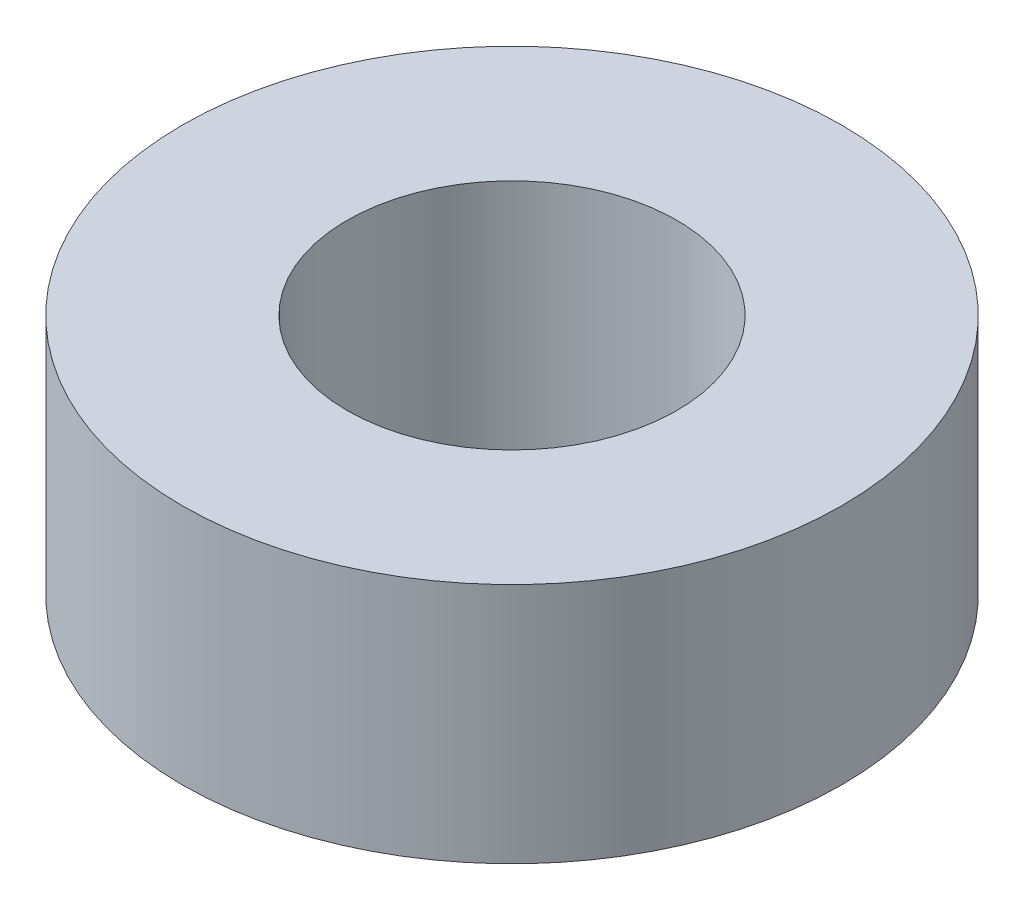
ISO-10303-21;
HEADER;
FILE_DESCRIPTION(('STEP AP214'),'2;1');
FILE_NAME('part.step','',(''),(''),'','','');
FILE_SCHEMA(('AUTOMOTIVE_DESIGN { 1 0 10303 214 1 1 1 1 }'));
ENDSEC;
DATA;
#1=APPLICATION_CONTEXT('core data for automotive mechanical design processes');
#2=APPLICATION_PROTOCOL_DEFINITION('international standard','automotive_design',2000,#1);
#3=PRODUCT_CONTEXT('',#1,'mechanical');
#4=PRODUCT('Part','Part','',(#3));
#5=PRODUCT_RELATED_PRODUCT_CATEGORY('part','',(#4));
#6=PRODUCT_DEFINITION_FORMATION('','',#4);
#7=PRODUCT_DEFINITION_CONTEXT('part definition',#1,'design');
#8=PRODUCT_DEFINITION('design','',#6,#7);
#9=PRODUCT_DEFINITION_SHAPE('','',#8);
#10=(LENGTH_UNIT() NAMED_UNIT(*) SI_UNIT(.MILLI.,.METRE.));
#11=(NAMED_UNIT(*) PLANE_ANGLE_UNIT() SI_UNIT($,.RADIAN.));
#12=(NAMED_UNIT(*) SI_UNIT($,.STERADIAN.) SOLID_ANGLE_UNIT());
#13=UNCERTAINTY_MEASURE_WITH_UNIT(LENGTH_MEASURE(1.E-05),#10,'distance_accuracy_value','');
#14=(GEOMETRIC_REPRESENTATION_CONTEXT(3) GLOBAL_UNCERTAINTY_ASSIGNED_CONTEXT((#13)) GLOBAL_UNIT_ASSIGNED_CONTEXT((#10,
#11,#12)) REPRESENTATION_CONTEXT('',''));
#15=CARTESIAN_POINT('',(0.,0.,0.));
#16=DIRECTION('',(0.,0.,1.));
#17=DIRECTION('',(1.,0.,0.));
#18=AXIS2_PLACEMENT_3D('',#15,#16,#17);
#19=CARTESIAN_POINT('',(0.,55.,0.));
#20=DIRECTION('',(0.,1.,0.));
#21=DIRECTION('',(0.,0.,1.));
#22=AXIS2_PLACEMENT_3D('',#19,#20,#21);
#23=PLANE('',#22);
#24=CARTESIAN_POINT('',(0.,55.,0.));
#25=DIRECTION('',(0.,1.,0.));
#26=DIRECTION('',(0.,0.,1.));
#27=AXIS2_PLACEMENT_3D('',#24,#25,#26);
#28=CIRCLE('',#27,150.);
#29=CARTESIAN_POINT('',(0.,55.,150.));
#30=VERTEX_POINT('',#29);
#31=EDGE_CURVE('E10',#30,#30,#28,.T.);
#32=ORIENTED_EDGE('',*,*,#31,.T.);
#33=EDGE_LOOP('',(#32));
#34=FACE_BOUND('',#33,.T.);
#35=CARTESIAN_POINT('',(0.,55.,0.));
#36=DIRECTION('',(0.,1.,0.));
#37=DIRECTION('',(0.,0.,1.));
#38=AXIS2_PLACEMENT_3D('',#35,#36,#37);
#39=CIRCLE('',#38,75.);
#40=CARTESIAN_POINT('',(0.,55.,75.));
#41=VERTEX_POINT('',#40);
#42=EDGE_CURVE('E54',#41,#41,#39,.T.);
#43=ORIENTED_EDGE('',*,*,#42,.F.);
#44=EDGE_LOOP('',(#43));
#45=FACE_BOUND('',#44,.T.);
#46=ADVANCED_FACE('F39',(#34,#45),#23,.T.);
#47=CARTESIAN_POINT('',(0.,-55.,0.));
#48=DIRECTION('',(0.,1.,0.));
#49=DIRECTION('',(0.,0.,1.));
#50=AXIS2_PLACEMENT_3D('',#47,#48,#49);
#51=PLANE('',#50);
#52=CARTESIAN_POINT('',(0.,-55.,0.));
#53=DIRECTION('',(0.,1.,0.));
#54=DIRECTION('',(0.,0.,1.));
#55=AXIS2_PLACEMENT_3D('',#52,#53,#54);
#56=CIRCLE('',#55,150.);
#57=CARTESIAN_POINT('',(0.,-55.,150.));
#58=VERTEX_POINT('',#57);
#59=EDGE_CURVE('E43',#58,#58,#56,.T.);
#60=ORIENTED_EDGE('',*,*,#59,.F.);
#61=EDGE_LOOP('',(#60));
#62=FACE_BOUND('',#61,.T.);
#63=CARTESIAN_POINT('',(0.,-55.,0.));
#64=DIRECTION('',(0.,1.,0.));
#65=DIRECTION('',(0.,0.,1.));
#66=AXIS2_PLACEMENT_3D('',#63,#64,#65);
#67=CIRCLE('',#66,75.);
#68=CARTESIAN_POINT('',(0.,-55.,75.));
#69=VERTEX_POINT('',#68);
#70=EDGE_CURVE('E56',#69,#69,#67,.T.);
#71=ORIENTED_EDGE('',*,*,#70,.T.);
#72=EDGE_LOOP('',(#71));
#73=FACE_BOUND('',#72,.T.);
#74=ADVANCED_FACE('F70',(#62,#73),#51,.F.);
#75=CARTESIAN_POINT('',(0.,55.,0.));
#76=DIRECTION('',(0.,-1.,0.));
#77=DIRECTION('',(0.,0.,-1.));
#78=AXIS2_PLACEMENT_3D('',#75,#76,#77);
#79=CYLINDRICAL_SURFACE('',#78,150.);
#80=ORIENTED_EDGE('',*,*,#31,.F.);
#81=EDGE_LOOP('',(#80));
#82=FACE_BOUND('',#81,.T.);
#83=ORIENTED_EDGE('',*,*,#59,.T.);
#84=EDGE_LOOP('',(#83));
#85=FACE_BOUND('',#84,.T.);
#86=ADVANCED_FACE('F41',(#82,#85),#79,.T.);
#87=CARTESIAN_POINT('',(0.,55.,0.));
#88=DIRECTION('',(0.,-1.,0.));
#89=DIRECTION('',(0.,0.,-1.));
#90=AXIS2_PLACEMENT_3D('',#87,#88,#89);
#91=CYLINDRICAL_SURFACE('',#90,75.);
#92=ORIENTED_EDGE('',*,*,#42,.T.);
#93=EDGE_LOOP('',(#92));
#94=FACE_BOUND('',#93,.T.);
#95=ORIENTED_EDGE('',*,*,#70,.F.);
#96=EDGE_LOOP('',(#95));
#97=FACE_BOUND('',#96,.T.);
#98=ADVANCED_FACE('F66',(#94,#97),#91,.F.);
#99=CLOSED_SHELL('',(#46,#74,#86,#98));
#100=MANIFOLD_SOLID_BREP('B2',#99);
#101=ADVANCED_BREP_SHAPE_REPRESENTATION('',(#18,#100),#14);
#102=SHAPE_DEFINITION_REPRESENTATION(#9,#101);
ENDSEC;
END-ISO-10303-21;
